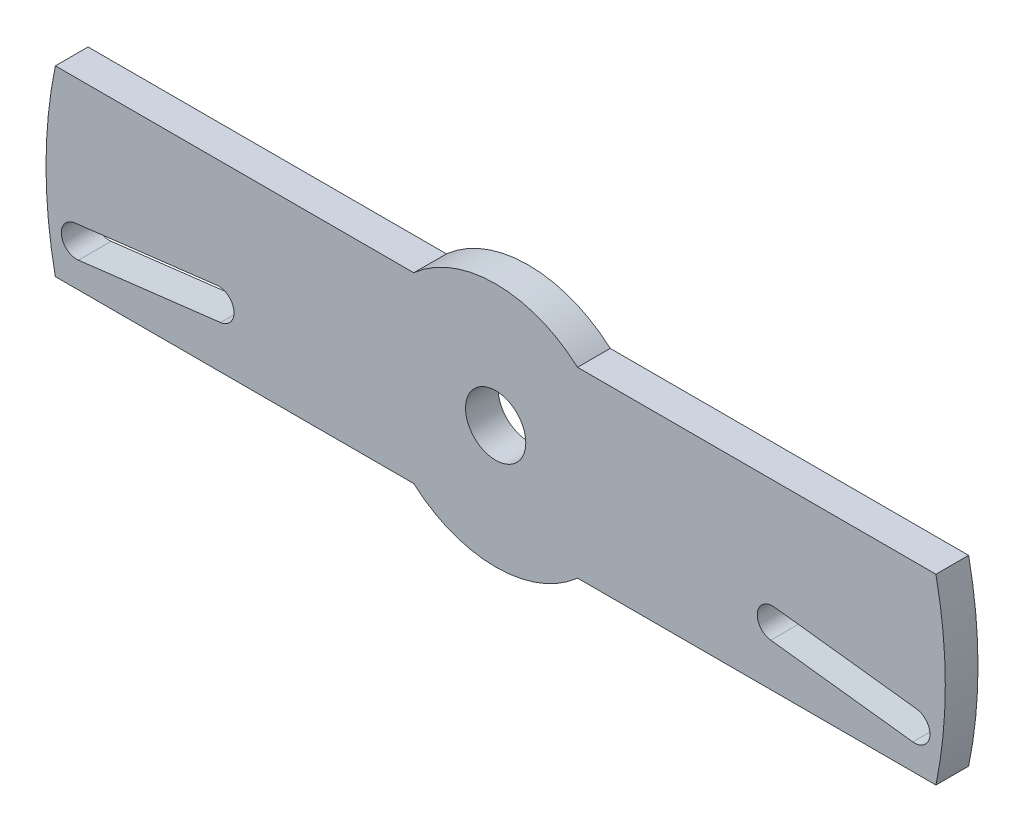
ISO-10303-21;
HEADER;
FILE_DESCRIPTION(('STEP AP214'),'2;1');
FILE_NAME('part.step','',(''),(''),'','','');
FILE_SCHEMA(('AUTOMOTIVE_DESIGN { 1 0 10303 214 1 1 1 1 }'));
ENDSEC;
DATA;
#1=APPLICATION_CONTEXT('core data for automotive mechanical design processes');
#2=APPLICATION_PROTOCOL_DEFINITION('international standard','automotive_design',2000,#1);
#3=PRODUCT_CONTEXT('',#1,'mechanical');
#4=PRODUCT('Part','Part','',(#3));
#5=PRODUCT_RELATED_PRODUCT_CATEGORY('part','',(#4));
#6=PRODUCT_DEFINITION_FORMATION('','',#4);
#7=PRODUCT_DEFINITION_CONTEXT('part definition',#1,'design');
#8=PRODUCT_DEFINITION('design','',#6,#7);
#9=PRODUCT_DEFINITION_SHAPE('','',#8);
#10=(LENGTH_UNIT() NAMED_UNIT(*) SI_UNIT(.MILLI.,.METRE.));
#11=(NAMED_UNIT(*) PLANE_ANGLE_UNIT() SI_UNIT($,.RADIAN.));
#12=(NAMED_UNIT(*) SI_UNIT($,.STERADIAN.) SOLID_ANGLE_UNIT());
#13=UNCERTAINTY_MEASURE_WITH_UNIT(LENGTH_MEASURE(1.E-05),#10,'distance_accuracy_value','');
#14=(GEOMETRIC_REPRESENTATION_CONTEXT(3) GLOBAL_UNCERTAINTY_ASSIGNED_CONTEXT((#13)) GLOBAL_UNIT_ASSIGNED_CONTEXT((#10,
#11,#12)) REPRESENTATION_CONTEXT('',''));
#15=CARTESIAN_POINT('',(0.,0.,0.));
#16=DIRECTION('',(0.,0.,1.));
#17=DIRECTION('',(1.,0.,0.));
#18=AXIS2_PLACEMENT_3D('',#15,#16,#17);
#19=CARTESIAN_POINT('',(0.,0.,3.2));
#20=DIRECTION('',(0.,0.,1.));
#21=DIRECTION('',(1.,0.,0.));
#22=AXIS2_PLACEMENT_3D('',#19,#20,#21);
#23=PLANE('',#22);
#24=CARTESIAN_POINT('',(0.,0.,3.2));
#25=DIRECTION('',(0.,0.,1.));
#26=DIRECTION('',(1.,0.,0.));
#27=AXIS2_PLACEMENT_3D('',#24,#25,#26);
#28=CIRCLE('',#27,44.);
#29=CARTESIAN_POINT('',(-43.0835752270245,8.93339496816975,3.2));
#30=VERTEX_POINT('',#29);
#31=CARTESIAN_POINT('',(-43.0835752270245,-8.93339496816975,3.2));
#32=VERTEX_POINT('',#31);
#33=EDGE_CURVE('E252',#30,#32,#28,.T.);
#34=ORIENTED_EDGE('',*,*,#33,.T.);
#35=DIRECTION('',(1.,0.,0.));
#36=VECTOR('',#35,1.);
#37=CARTESIAN_POINT('',(-43.0835752270245,-8.93339496816975,3.2));
#38=LINE('',#37,#36);
#39=CARTESIAN_POINT('',(-8.01214417884997,-8.93339496816975,3.2));
#40=VERTEX_POINT('',#39);
#41=EDGE_CURVE('E256',#32,#40,#38,.T.);
#42=ORIENTED_EDGE('',*,*,#41,.T.);
#43=CARTESIAN_POINT('',(0.,0.,3.2));
#44=DIRECTION('',(0.,0.,1.));
#45=DIRECTION('',(1.,0.,0.));
#46=AXIS2_PLACEMENT_3D('',#43,#44,#45);
#47=CIRCLE('',#46,12.);
#48=CARTESIAN_POINT('',(8.01214417884997,-8.93339496816975,3.2));
#49=VERTEX_POINT('',#48);
#50=EDGE_CURVE('E260',#40,#49,#47,.T.);
#51=ORIENTED_EDGE('',*,*,#50,.T.);
#52=DIRECTION('',(1.,0.,0.));
#53=VECTOR('',#52,1.);
#54=CARTESIAN_POINT('',(43.0835752270245,-8.93339496816975,3.2));
#55=LINE('',#54,#53);
#56=CARTESIAN_POINT('',(43.0835752270245,-8.93339496816974,3.2));
#57=VERTEX_POINT('',#56);
#58=EDGE_CURVE('E263',#49,#57,#55,.T.);
#59=ORIENTED_EDGE('',*,*,#58,.T.);
#60=CARTESIAN_POINT('',(0.,0.,3.2));
#61=DIRECTION('',(0.,0.,1.));
#62=DIRECTION('',(-1.,0.,0.));
#63=AXIS2_PLACEMENT_3D('',#60,#61,#62);
#64=CIRCLE('',#63,44.);
#65=CARTESIAN_POINT('',(43.0835752270245,8.93339496816975,3.2));
#66=VERTEX_POINT('',#65);
#67=EDGE_CURVE('E266',#57,#66,#64,.T.);
#68=ORIENTED_EDGE('',*,*,#67,.T.);
#69=DIRECTION('',(-1.,0.,0.));
#70=VECTOR('',#69,1.);
#71=CARTESIAN_POINT('',(43.0835752270245,8.93339496816975,3.2));
#72=LINE('',#71,#70);
#73=CARTESIAN_POINT('',(8.01214417884997,8.93339496816975,3.2));
#74=VERTEX_POINT('',#73);
#75=EDGE_CURVE('E269',#66,#74,#72,.T.);
#76=ORIENTED_EDGE('',*,*,#75,.T.);
#77=CARTESIAN_POINT('',(0.,0.,3.2));
#78=DIRECTION('',(0.,0.,1.));
#79=DIRECTION('',(1.,0.,0.));
#80=AXIS2_PLACEMENT_3D('',#77,#78,#79);
#81=CIRCLE('',#80,12.);
#82=CARTESIAN_POINT('',(-8.01214417884997,8.93339496816975,3.2));
#83=VERTEX_POINT('',#82);
#84=EDGE_CURVE('E272',#74,#83,#81,.T.);
#85=ORIENTED_EDGE('',*,*,#84,.T.);
#86=DIRECTION('',(-1.,0.,0.));
#87=VECTOR('',#86,1.);
#88=CARTESIAN_POINT('',(-43.0835752270245,8.93339496816975,3.2));
#89=LINE('',#88,#87);
#90=EDGE_CURVE('E275',#83,#30,#89,.T.);
#91=ORIENTED_EDGE('',*,*,#90,.T.);
#92=EDGE_LOOP('',(#34,#42,#51,#59,#68,#76,#85,#91));
#93=FACE_BOUND('',#92,.T.);
#94=CARTESIAN_POINT('',(0.,0.,3.2));
#95=DIRECTION('',(0.,0.,1.));
#96=DIRECTION('',(1.,0.,0.));
#97=AXIS2_PLACEMENT_3D('',#94,#95,#96);
#98=CIRCLE('',#97,2.95);
#99=CARTESIAN_POINT('',(2.95,0.,3.2));
#100=VERTEX_POINT('',#99);
#101=EDGE_CURVE('E244',#100,#100,#98,.T.);
#102=ORIENTED_EDGE('',*,*,#101,.F.);
#103=EDGE_LOOP('',(#102));
#104=FACE_BOUND('',#103,.T.);
#105=DIRECTION('',(0.992885299345467,0.119074692288758,0.));
#106=VECTOR('',#105,1.);
#107=CARTESIAN_POINT('',(-40.8213879615669,-6.4063736410608,3.2));
#108=LINE('',#107,#106);
#109=CARTESIAN_POINT('',(-40.8213879615669,-6.4063736410608,3.2));
#110=VERTEX_POINT('',#109);
#111=CARTESIAN_POINT('',(-26.9209937707303,-4.7393279490182,3.2));
#112=VERTEX_POINT('',#111);
#113=EDGE_CURVE('E204',#110,#112,#108,.T.);
#114=ORIENTED_EDGE('',*,*,#113,.F.);
#115=CARTESIAN_POINT('',(-41.,-4.91704569204261,3.2));
#116=DIRECTION('',(0.,0.,1.));
#117=DIRECTION('',(1.,0.,0.));
#118=AXIS2_PLACEMENT_3D('',#115,#116,#117);
#119=CIRCLE('',#118,1.5);
#120=CARTESIAN_POINT('',(-41.1786120384331,-3.42771774302441,3.2));
#121=VERTEX_POINT('',#120);
#122=EDGE_CURVE('E201',#121,#110,#119,.T.);
#123=ORIENTED_EDGE('',*,*,#122,.F.);
#124=DIRECTION('',(-0.992885299345467,-0.119074692288758,0.));
#125=VECTOR('',#124,1.);
#126=CARTESIAN_POINT('',(-41.1786120384331,-3.42771774302441,3.2));
#127=LINE('',#126,#125);
#128=CARTESIAN_POINT('',(-27.2782178475966,-1.7606720509818,3.2));
#129=VERTEX_POINT('',#128);
#130=EDGE_CURVE('E212',#129,#121,#127,.T.);
#131=ORIENTED_EDGE('',*,*,#130,.F.);
#132=CARTESIAN_POINT('',(-27.0996058091635,-3.25,3.2));
#133=DIRECTION('',(0.,0.,1.));
#134=DIRECTION('',(1.,0.,0.));
#135=AXIS2_PLACEMENT_3D('',#132,#133,#134);
#136=CIRCLE('',#135,1.5);
#137=EDGE_CURVE('E208',#112,#129,#136,.T.);
#138=ORIENTED_EDGE('',*,*,#137,.F.);
#139=EDGE_LOOP('',(#114,#123,#131,#138));
#140=FACE_BOUND('',#139,.T.);
#141=DIRECTION('',(-0.992885299345467,0.119074692288758,0.));
#142=VECTOR('',#141,1.);
#143=CARTESIAN_POINT('',(41.1786120384331,-3.42771774302441,3.2));
#144=LINE('',#143,#142);
#145=CARTESIAN_POINT('',(41.1786120384331,-3.42771774302441,3.2));
#146=VERTEX_POINT('',#145);
#147=CARTESIAN_POINT('',(27.2782178475966,-1.7606720509818,3.2));
#148=VERTEX_POINT('',#147);
#149=EDGE_CURVE('E162',#146,#148,#144,.T.);
#150=ORIENTED_EDGE('',*,*,#149,.F.);
#151=CARTESIAN_POINT('',(41.,-4.91704569204261,3.2));
#152=DIRECTION('',(0.,0.,1.));
#153=DIRECTION('',(-1.,0.,0.));
#154=AXIS2_PLACEMENT_3D('',#151,#152,#153);
#155=CIRCLE('',#154,1.5);
#156=CARTESIAN_POINT('',(40.8213879615669,-6.4063736410608,3.2));
#157=VERTEX_POINT('',#156);
#158=EDGE_CURVE('E153',#157,#146,#155,.T.);
#159=ORIENTED_EDGE('',*,*,#158,.F.);
#160=DIRECTION('',(0.992885299345467,-0.119074692288758,0.));
#161=VECTOR('',#160,1.);
#162=CARTESIAN_POINT('',(40.8213879615669,-6.4063736410608,3.2));
#163=LINE('',#162,#161);
#164=CARTESIAN_POINT('',(26.9209937707303,-4.7393279490182,3.2));
#165=VERTEX_POINT('',#164);
#166=EDGE_CURVE('E179',#165,#157,#163,.T.);
#167=ORIENTED_EDGE('',*,*,#166,.F.);
#168=CARTESIAN_POINT('',(27.0996058091635,-3.25,3.2));
#169=DIRECTION('',(0.,0.,1.));
#170=DIRECTION('',(-1.,0.,0.));
#171=AXIS2_PLACEMENT_3D('',#168,#169,#170);
#172=CIRCLE('',#171,1.5);
#173=EDGE_CURVE('E175',#148,#165,#172,.T.);
#174=ORIENTED_EDGE('',*,*,#173,.F.);
#175=EDGE_LOOP('',(#150,#159,#167,#174));
#176=FACE_BOUND('',#175,.T.);
#177=ADVANCED_FACE('F39',(#93,#104,#140,#176),#23,.T.);
#178=CARTESIAN_POINT('',(0.,0.,0.));
#179=DIRECTION('',(0.,0.,1.));
#180=DIRECTION('',(1.,0.,0.));
#181=AXIS2_PLACEMENT_3D('',#178,#179,#180);
#182=PLANE('',#181);
#183=CARTESIAN_POINT('',(-41.,-4.91704569204261,0.));
#184=DIRECTION('',(0.,0.,1.));
#185=DIRECTION('',(1.,0.,0.));
#186=AXIS2_PLACEMENT_3D('',#183,#184,#185);
#187=CIRCLE('',#186,1.5);
#188=CARTESIAN_POINT('',(-41.1786120384331,-3.42771774302441,0.));
#189=VERTEX_POINT('',#188);
#190=CARTESIAN_POINT('',(-40.8213879615669,-6.4063736410608,0.));
#191=VERTEX_POINT('',#190);
#192=EDGE_CURVE('E171',#189,#191,#187,.T.);
#193=ORIENTED_EDGE('',*,*,#192,.T.);
#194=DIRECTION('',(0.992885299345467,0.119074692288758,0.));
#195=VECTOR('',#194,1.);
#196=CARTESIAN_POINT('',(-40.8213879615669,-6.4063736410608,0.));
#197=LINE('',#196,#195);
#198=CARTESIAN_POINT('',(-26.9209937707303,-4.7393279490182,0.));
#199=VERTEX_POINT('',#198);
#200=EDGE_CURVE('E219',#191,#199,#197,.T.);
#201=ORIENTED_EDGE('',*,*,#200,.T.);
#202=CARTESIAN_POINT('',(-27.0996058091635,-3.25,0.));
#203=DIRECTION('',(0.,0.,1.));
#204=DIRECTION('',(1.,0.,0.));
#205=AXIS2_PLACEMENT_3D('',#202,#203,#204);
#206=CIRCLE('',#205,1.5);
#207=CARTESIAN_POINT('',(-27.2782178475966,-1.7606720509818,0.));
#208=VERTEX_POINT('',#207);
#209=EDGE_CURVE('E223',#199,#208,#206,.T.);
#210=ORIENTED_EDGE('',*,*,#209,.T.);
#211=DIRECTION('',(-0.992885299345467,-0.119074692288758,0.));
#212=VECTOR('',#211,1.);
#213=CARTESIAN_POINT('',(-41.1786120384331,-3.42771774302441,0.));
#214=LINE('',#213,#212);
#215=EDGE_CURVE('E205',#208,#189,#214,.T.);
#216=ORIENTED_EDGE('',*,*,#215,.T.);
#217=EDGE_LOOP('',(#193,#201,#210,#216));
#218=FACE_BOUND('',#217,.T.);
#219=CARTESIAN_POINT('',(0.,0.,0.));
#220=DIRECTION('',(0.,0.,1.));
#221=DIRECTION('',(1.,0.,0.));
#222=AXIS2_PLACEMENT_3D('',#219,#220,#221);
#223=CIRCLE('',#222,44.);
#224=CARTESIAN_POINT('',(-43.0835752270245,8.93339496816975,0.));
#225=VERTEX_POINT('',#224);
#226=CARTESIAN_POINT('',(-43.0835752270245,-8.93339496816975,0.));
#227=VERTEX_POINT('',#226);
#228=EDGE_CURVE('E248',#225,#227,#223,.T.);
#229=ORIENTED_EDGE('',*,*,#228,.F.);
#230=DIRECTION('',(-1.,0.,0.));
#231=VECTOR('',#230,1.);
#232=CARTESIAN_POINT('',(-43.0835752270245,8.93339496816975,0.));
#233=LINE('',#232,#231);
#234=CARTESIAN_POINT('',(-8.01214417884997,8.93339496816975,0.));
#235=VERTEX_POINT('',#234);
#236=EDGE_CURVE('E257',#235,#225,#233,.T.);
#237=ORIENTED_EDGE('',*,*,#236,.F.);
#238=CARTESIAN_POINT('',(0.,0.,0.));
#239=DIRECTION('',(0.,0.,1.));
#240=DIRECTION('',(1.,0.,0.));
#241=AXIS2_PLACEMENT_3D('',#238,#239,#240);
#242=CIRCLE('',#241,12.);
#243=CARTESIAN_POINT('',(8.01214417884997,8.93339496816975,0.));
#244=VERTEX_POINT('',#243);
#245=EDGE_CURVE('E297',#244,#235,#242,.T.);
#246=ORIENTED_EDGE('',*,*,#245,.F.);
#247=DIRECTION('',(-1.,0.,0.));
#248=VECTOR('',#247,1.);
#249=CARTESIAN_POINT('',(43.0835752270245,8.93339496816975,0.));
#250=LINE('',#249,#248);
#251=CARTESIAN_POINT('',(43.0835752270245,8.93339496816975,0.));
#252=VERTEX_POINT('',#251);
#253=EDGE_CURVE('E294',#252,#244,#250,.T.);
#254=ORIENTED_EDGE('',*,*,#253,.F.);
#255=CARTESIAN_POINT('',(0.,0.,0.));
#256=DIRECTION('',(0.,0.,1.));
#257=DIRECTION('',(-1.,0.,0.));
#258=AXIS2_PLACEMENT_3D('',#255,#256,#257);
#259=CIRCLE('',#258,44.);
#260=CARTESIAN_POINT('',(43.0835752270245,-8.93339496816974,0.));
#261=VERTEX_POINT('',#260);
#262=EDGE_CURVE('E291',#261,#252,#259,.T.);
#263=ORIENTED_EDGE('',*,*,#262,.F.);
#264=DIRECTION('',(1.,0.,0.));
#265=VECTOR('',#264,1.);
#266=CARTESIAN_POINT('',(43.0835752270245,-8.93339496816975,0.));
#267=LINE('',#266,#265);
#268=CARTESIAN_POINT('',(8.01214417884997,-8.93339496816975,0.));
#269=VERTEX_POINT('',#268);
#270=EDGE_CURVE('E288',#269,#261,#267,.T.);
#271=ORIENTED_EDGE('',*,*,#270,.F.);
#272=CARTESIAN_POINT('',(0.,0.,0.));
#273=DIRECTION('',(0.,0.,1.));
#274=DIRECTION('',(1.,0.,0.));
#275=AXIS2_PLACEMENT_3D('',#272,#273,#274);
#276=CIRCLE('',#275,12.);
#277=CARTESIAN_POINT('',(-8.01214417884997,-8.93339496816975,0.));
#278=VERTEX_POINT('',#277);
#279=EDGE_CURVE('E285',#278,#269,#276,.T.);
#280=ORIENTED_EDGE('',*,*,#279,.F.);
#281=DIRECTION('',(1.,0.,0.));
#282=VECTOR('',#281,1.);
#283=CARTESIAN_POINT('',(-43.0835752270245,-8.93339496816975,0.));
#284=LINE('',#283,#282);
#285=EDGE_CURVE('E282',#227,#278,#284,.T.);
#286=ORIENTED_EDGE('',*,*,#285,.F.);
#287=EDGE_LOOP('',(#229,#237,#246,#254,#263,#271,#280,#286));
#288=FACE_BOUND('',#287,.T.);
#289=CARTESIAN_POINT('',(0.,0.,0.));
#290=DIRECTION('',(0.,0.,1.));
#291=DIRECTION('',(1.,0.,0.));
#292=AXIS2_PLACEMENT_3D('',#289,#290,#291);
#293=CIRCLE('',#292,2.95);
#294=CARTESIAN_POINT('',(2.95,0.,0.));
#295=VERTEX_POINT('',#294);
#296=EDGE_CURVE('E243',#295,#295,#293,.T.);
#297=ORIENTED_EDGE('',*,*,#296,.T.);
#298=EDGE_LOOP('',(#297));
#299=FACE_BOUND('',#298,.T.);
#300=CARTESIAN_POINT('',(41.,-4.91704569204261,0.));
#301=DIRECTION('',(0.,0.,1.));
#302=DIRECTION('',(-1.,0.,0.));
#303=AXIS2_PLACEMENT_3D('',#300,#301,#302);
#304=CIRCLE('',#303,1.5);
#305=CARTESIAN_POINT('',(40.8213879615669,-6.4063736410608,0.));
#306=VERTEX_POINT('',#305);
#307=CARTESIAN_POINT('',(41.1786120384331,-3.42771774302441,0.));
#308=VERTEX_POINT('',#307);
#309=EDGE_CURVE('E63',#306,#308,#304,.T.);
#310=ORIENTED_EDGE('',*,*,#309,.T.);
#311=DIRECTION('',(-0.992885299345467,0.119074692288758,0.));
#312=VECTOR('',#311,1.);
#313=CARTESIAN_POINT('',(41.1786120384331,-3.42771774302441,0.));
#314=LINE('',#313,#312);
#315=CARTESIAN_POINT('',(27.2782178475966,-1.7606720509818,0.));
#316=VERTEX_POINT('',#315);
#317=EDGE_CURVE('E169',#308,#316,#314,.T.);
#318=ORIENTED_EDGE('',*,*,#317,.T.);
#319=CARTESIAN_POINT('',(27.0996058091635,-3.25,0.));
#320=DIRECTION('',(0.,0.,1.));
#321=DIRECTION('',(-1.,0.,0.));
#322=AXIS2_PLACEMENT_3D('',#319,#320,#321);
#323=CIRCLE('',#322,1.5);
#324=CARTESIAN_POINT('',(26.9209937707303,-4.7393279490182,0.));
#325=VERTEX_POINT('',#324);
#326=EDGE_CURVE('E188',#316,#325,#323,.T.);
#327=ORIENTED_EDGE('',*,*,#326,.T.);
#328=DIRECTION('',(0.992885299345467,-0.119074692288758,0.));
#329=VECTOR('',#328,1.);
#330=CARTESIAN_POINT('',(40.8213879615669,-6.4063736410608,0.));
#331=LINE('',#330,#329);
#332=EDGE_CURVE('E163',#325,#306,#331,.T.);
#333=ORIENTED_EDGE('',*,*,#332,.T.);
#334=EDGE_LOOP('',(#310,#318,#327,#333));
#335=FACE_BOUND('',#334,.T.);
#336=ADVANCED_FACE('F336',(#218,#288,#299,#335),#182,.F.);
#337=CARTESIAN_POINT('',(0.,0.,3.2));
#338=DIRECTION('',(0.,0.,-1.));
#339=DIRECTION('',(-1.,0.,0.));
#340=AXIS2_PLACEMENT_3D('',#337,#338,#339);
#341=CYLINDRICAL_SURFACE('',#340,44.);
#342=ORIENTED_EDGE('',*,*,#228,.T.);
#343=DIRECTION('',(0.,0.,-1.));
#344=VECTOR('',#343,1.);
#345=CARTESIAN_POINT('',(-43.0835752270245,-8.93339496816975,3.2));
#346=LINE('',#345,#344);
#347=EDGE_CURVE('E11',#32,#227,#346,.T.);
#348=ORIENTED_EDGE('',*,*,#347,.F.);
#349=ORIENTED_EDGE('',*,*,#33,.F.);
#350=DIRECTION('',(0.,0.,-1.));
#351=VECTOR('',#350,1.);
#352=CARTESIAN_POINT('',(-43.0835752270245,8.93339496816975,3.2));
#353=LINE('',#352,#351);
#354=EDGE_CURVE('E278',#30,#225,#353,.T.);
#355=ORIENTED_EDGE('',*,*,#354,.T.);
#356=EDGE_LOOP('',(#342,#348,#349,#355));
#357=FACE_BOUND('',#356,.T.);
#358=ADVANCED_FACE('F41',(#357),#341,.T.);
#359=CARTESIAN_POINT('',(-43.0835752270245,-8.93339496816975,3.2));
#360=DIRECTION('',(0.,1.,0.));
#361=DIRECTION('',(0.,0.,1.));
#362=AXIS2_PLACEMENT_3D('',#359,#360,#361);
#363=PLANE('',#362);
#364=ORIENTED_EDGE('',*,*,#285,.T.);
#365=DIRECTION('',(0.,0.,-1.));
#366=VECTOR('',#365,1.);
#367=CARTESIAN_POINT('',(-8.01214417884997,-8.93339496816975,3.2));
#368=LINE('',#367,#366);
#369=EDGE_CURVE('E48',#40,#278,#368,.T.);
#370=ORIENTED_EDGE('',*,*,#369,.F.);
#371=ORIENTED_EDGE('',*,*,#41,.F.);
#372=ORIENTED_EDGE('',*,*,#347,.T.);
#373=EDGE_LOOP('',(#364,#370,#371,#372));
#374=FACE_BOUND('',#373,.T.);
#375=ADVANCED_FACE('F354',(#374),#363,.F.);
#376=CARTESIAN_POINT('',(0.,0.,3.2));
#377=DIRECTION('',(0.,0.,-1.));
#378=DIRECTION('',(-1.,0.,0.));
#379=AXIS2_PLACEMENT_3D('',#376,#377,#378);
#380=CYLINDRICAL_SURFACE('',#379,12.);
#381=ORIENTED_EDGE('',*,*,#279,.T.);
#382=DIRECTION('',(0.,0.,-1.));
#383=VECTOR('',#382,1.);
#384=CARTESIAN_POINT('',(8.01214417884997,-8.93339496816975,3.2));
#385=LINE('',#384,#383);
#386=EDGE_CURVE('E321',#49,#269,#385,.T.);
#387=ORIENTED_EDGE('',*,*,#386,.F.);
#388=ORIENTED_EDGE('',*,*,#50,.F.);
#389=ORIENTED_EDGE('',*,*,#369,.T.);
#390=EDGE_LOOP('',(#381,#387,#388,#389));
#391=FACE_BOUND('',#390,.T.);
#392=ADVANCED_FACE('F330',(#391),#380,.T.);
#393=CARTESIAN_POINT('',(43.0835752270245,-8.93339496816975,3.2));
#394=DIRECTION('',(0.,1.,0.));
#395=DIRECTION('',(0.,0.,1.));
#396=AXIS2_PLACEMENT_3D('',#393,#394,#395);
#397=PLANE('',#396);
#398=ORIENTED_EDGE('',*,*,#270,.T.);
#399=DIRECTION('',(0.,0.,-1.));
#400=VECTOR('',#399,1.);
#401=CARTESIAN_POINT('',(43.0835752270245,-8.93339496816974,3.2));
#402=LINE('',#401,#400);
#403=EDGE_CURVE('E317',#57,#261,#402,.T.);
#404=ORIENTED_EDGE('',*,*,#403,.F.);
#405=ORIENTED_EDGE('',*,*,#58,.F.);
#406=ORIENTED_EDGE('',*,*,#386,.T.);
#407=EDGE_LOOP('',(#398,#404,#405,#406));
#408=FACE_BOUND('',#407,.T.);
#409=ADVANCED_FACE('F342',(#408),#397,.F.);
#410=CARTESIAN_POINT('',(0.,0.,3.2));
#411=DIRECTION('',(0.,0.,-1.));
#412=DIRECTION('',(-1.,0.,0.));
#413=AXIS2_PLACEMENT_3D('',#410,#411,#412);
#414=CYLINDRICAL_SURFACE('',#413,44.);
#415=ORIENTED_EDGE('',*,*,#262,.T.);
#416=DIRECTION('',(0.,0.,-1.));
#417=VECTOR('',#416,1.);
#418=CARTESIAN_POINT('',(43.0835752270245,8.93339496816975,3.2));
#419=LINE('',#418,#417);
#420=EDGE_CURVE('E313',#66,#252,#419,.T.);
#421=ORIENTED_EDGE('',*,*,#420,.F.);
#422=ORIENTED_EDGE('',*,*,#67,.F.);
#423=ORIENTED_EDGE('',*,*,#403,.T.);
#424=EDGE_LOOP('',(#415,#421,#422,#423));
#425=FACE_BOUND('',#424,.T.);
#426=ADVANCED_FACE('F346',(#425),#414,.T.);
#427=CARTESIAN_POINT('',(43.0835752270245,8.93339496816975,3.2));
#428=DIRECTION('',(0.,-1.,0.));
#429=DIRECTION('',(0.,0.,-1.));
#430=AXIS2_PLACEMENT_3D('',#427,#428,#429);
#431=PLANE('',#430);
#432=ORIENTED_EDGE('',*,*,#253,.T.);
#433=DIRECTION('',(0.,0.,-1.));
#434=VECTOR('',#433,1.);
#435=CARTESIAN_POINT('',(8.01214417884997,8.93339496816975,3.2));
#436=LINE('',#435,#434);
#437=EDGE_CURVE('E309',#74,#244,#436,.T.);
#438=ORIENTED_EDGE('',*,*,#437,.F.);
#439=ORIENTED_EDGE('',*,*,#75,.F.);
#440=ORIENTED_EDGE('',*,*,#420,.T.);
#441=EDGE_LOOP('',(#432,#438,#439,#440));
#442=FACE_BOUND('',#441,.T.);
#443=ADVANCED_FACE('F367',(#442),#431,.F.);
#444=CARTESIAN_POINT('',(0.,0.,3.2));
#445=DIRECTION('',(0.,0.,-1.));
#446=DIRECTION('',(-1.,0.,0.));
#447=AXIS2_PLACEMENT_3D('',#444,#445,#446);
#448=CYLINDRICAL_SURFACE('',#447,12.);
#449=ORIENTED_EDGE('',*,*,#245,.T.);
#450=DIRECTION('',(0.,0.,-1.));
#451=VECTOR('',#450,1.);
#452=CARTESIAN_POINT('',(-8.01214417884997,8.93339496816975,3.2));
#453=LINE('',#452,#451);
#454=EDGE_CURVE('E305',#83,#235,#453,.T.);
#455=ORIENTED_EDGE('',*,*,#454,.F.);
#456=ORIENTED_EDGE('',*,*,#84,.F.);
#457=ORIENTED_EDGE('',*,*,#437,.T.);
#458=EDGE_LOOP('',(#449,#455,#456,#457));
#459=FACE_BOUND('',#458,.T.);
#460=ADVANCED_FACE('F365',(#459),#448,.T.);
#461=CARTESIAN_POINT('',(-43.0835752270245,8.93339496816975,3.2));
#462=DIRECTION('',(0.,-1.,0.));
#463=DIRECTION('',(0.,0.,-1.));
#464=AXIS2_PLACEMENT_3D('',#461,#462,#463);
#465=PLANE('',#464);
#466=ORIENTED_EDGE('',*,*,#236,.T.);
#467=ORIENTED_EDGE('',*,*,#354,.F.);
#468=ORIENTED_EDGE('',*,*,#90,.F.);
#469=ORIENTED_EDGE('',*,*,#454,.T.);
#470=EDGE_LOOP('',(#466,#467,#468,#469));
#471=FACE_BOUND('',#470,.T.);
#472=ADVANCED_FACE('F360',(#471),#465,.F.);
#473=CARTESIAN_POINT('',(0.,0.,3.2));
#474=DIRECTION('',(0.,0.,-1.));
#475=DIRECTION('',(-1.,0.,0.));
#476=AXIS2_PLACEMENT_3D('',#473,#474,#475);
#477=CYLINDRICAL_SURFACE('',#476,2.95);
#478=ORIENTED_EDGE('',*,*,#101,.T.);
#479=EDGE_LOOP('',(#478));
#480=FACE_BOUND('',#479,.T.);
#481=ORIENTED_EDGE('',*,*,#296,.F.);
#482=EDGE_LOOP('',(#481));
#483=FACE_BOUND('',#482,.T.);
#484=ADVANCED_FACE('F384',(#480,#483),#477,.F.);
#485=CARTESIAN_POINT('',(-41.,-4.91704569204261,3.2));
#486=DIRECTION('',(0.,0.,-1.));
#487=DIRECTION('',(-1.,0.,0.));
#488=AXIS2_PLACEMENT_3D('',#485,#486,#487);
#489=CYLINDRICAL_SURFACE('',#488,1.5);
#490=ORIENTED_EDGE('',*,*,#192,.F.);
#491=DIRECTION('',(0.,0.,-1.));
#492=VECTOR('',#491,1.);
#493=CARTESIAN_POINT('',(-41.1786120384331,-3.42771774302441,3.2));
#494=LINE('',#493,#492);
#495=EDGE_CURVE('E215',#121,#189,#494,.T.);
#496=ORIENTED_EDGE('',*,*,#495,.F.);
#497=ORIENTED_EDGE('',*,*,#122,.T.);
#498=DIRECTION('',(0.,0.,-1.));
#499=VECTOR('',#498,1.);
#500=CARTESIAN_POINT('',(-40.8213879615669,-6.4063736410608,3.2));
#501=LINE('',#500,#499);
#502=EDGE_CURVE('E239',#110,#191,#501,.T.);
#503=ORIENTED_EDGE('',*,*,#502,.T.);
#504=EDGE_LOOP('',(#490,#496,#497,#503));
#505=FACE_BOUND('',#504,.T.);
#506=ADVANCED_FACE('F391',(#505),#489,.F.);
#507=CARTESIAN_POINT('',(-40.8213879615669,-6.4063736410608,3.2));
#508=DIRECTION('',(-0.119074692288758,0.992885299345467,0.));
#509=DIRECTION('',(-0.992885299345467,-0.119074692288758,0.));
#510=AXIS2_PLACEMENT_3D('',#507,#508,#509);
#511=PLANE('',#510);
#512=ORIENTED_EDGE('',*,*,#200,.F.);
#513=ORIENTED_EDGE('',*,*,#502,.F.);
#514=ORIENTED_EDGE('',*,*,#113,.T.);
#515=DIRECTION('',(0.,0.,-1.));
#516=VECTOR('',#515,1.);
#517=CARTESIAN_POINT('',(-26.9209937707303,-4.7393279490182,3.2));
#518=LINE('',#517,#516);
#519=EDGE_CURVE('E236',#112,#199,#518,.T.);
#520=ORIENTED_EDGE('',*,*,#519,.T.);
#521=EDGE_LOOP('',(#512,#513,#514,#520));
#522=FACE_BOUND('',#521,.T.);
#523=ADVANCED_FACE('F396',(#522),#511,.T.);
#524=CARTESIAN_POINT('',(-27.0996058091635,-3.25,3.2));
#525=DIRECTION('',(0.,0.,-1.));
#526=DIRECTION('',(-1.,0.,0.));
#527=AXIS2_PLACEMENT_3D('',#524,#525,#526);
#528=CYLINDRICAL_SURFACE('',#527,1.5);
#529=ORIENTED_EDGE('',*,*,#209,.F.);
#530=ORIENTED_EDGE('',*,*,#519,.F.);
#531=ORIENTED_EDGE('',*,*,#137,.T.);
#532=DIRECTION('',(0.,0.,-1.));
#533=VECTOR('',#532,1.);
#534=CARTESIAN_POINT('',(-27.2782178475966,-1.7606720509818,3.2));
#535=LINE('',#534,#533);
#536=EDGE_CURVE('E233',#129,#208,#535,.T.);
#537=ORIENTED_EDGE('',*,*,#536,.T.);
#538=EDGE_LOOP('',(#529,#530,#531,#537));
#539=FACE_BOUND('',#538,.T.);
#540=ADVANCED_FACE('F420',(#539),#528,.F.);
#541=CARTESIAN_POINT('',(-41.1786120384331,-3.42771774302441,3.2));
#542=DIRECTION('',(0.119074692288758,-0.992885299345467,0.));
#543=DIRECTION('',(0.992885299345467,0.119074692288758,0.));
#544=AXIS2_PLACEMENT_3D('',#541,#542,#543);
#545=PLANE('',#544);
#546=ORIENTED_EDGE('',*,*,#215,.F.);
#547=ORIENTED_EDGE('',*,*,#536,.F.);
#548=ORIENTED_EDGE('',*,*,#130,.T.);
#549=ORIENTED_EDGE('',*,*,#495,.T.);
#550=EDGE_LOOP('',(#546,#547,#548,#549));
#551=FACE_BOUND('',#550,.T.);
#552=ADVANCED_FACE('F417',(#551),#545,.T.);
#553=CARTESIAN_POINT('',(41.,-4.91704569204261,3.2));
#554=DIRECTION('',(0.,0.,-1.));
#555=DIRECTION('',(-1.,0.,0.));
#556=AXIS2_PLACEMENT_3D('',#553,#554,#555);
#557=CYLINDRICAL_SURFACE('',#556,1.5);
#558=ORIENTED_EDGE('',*,*,#309,.F.);
#559=DIRECTION('',(0.,0.,-1.));
#560=VECTOR('',#559,1.);
#561=CARTESIAN_POINT('',(40.8213879615669,-6.4063736410608,3.2));
#562=LINE('',#561,#560);
#563=EDGE_CURVE('E157',#157,#306,#562,.T.);
#564=ORIENTED_EDGE('',*,*,#563,.F.);
#565=ORIENTED_EDGE('',*,*,#158,.T.);
#566=DIRECTION('',(0.,0.,-1.));
#567=VECTOR('',#566,1.);
#568=CARTESIAN_POINT('',(41.1786120384331,-3.42771774302441,3.2));
#569=LINE('',#568,#567);
#570=EDGE_CURVE('E156',#146,#308,#569,.T.);
#571=ORIENTED_EDGE('',*,*,#570,.T.);
#572=EDGE_LOOP('',(#558,#564,#565,#571));
#573=FACE_BOUND('',#572,.T.);
#574=ADVANCED_FACE('F155',(#573),#557,.F.);
#575=CARTESIAN_POINT('',(41.1786120384331,-3.42771774302441,3.2));
#576=DIRECTION('',(-0.119074692288758,-0.992885299345467,0.));
#577=DIRECTION('',(0.992885299345467,-0.119074692288758,0.));
#578=AXIS2_PLACEMENT_3D('',#575,#576,#577);
#579=PLANE('',#578);
#580=ORIENTED_EDGE('',*,*,#317,.F.);
#581=ORIENTED_EDGE('',*,*,#570,.F.);
#582=ORIENTED_EDGE('',*,*,#149,.T.);
#583=DIRECTION('',(0.,0.,-1.));
#584=VECTOR('',#583,1.);
#585=CARTESIAN_POINT('',(27.2782178475966,-1.7606720509818,3.2));
#586=LINE('',#585,#584);
#587=EDGE_CURVE('E172',#148,#316,#586,.T.);
#588=ORIENTED_EDGE('',*,*,#587,.T.);
#589=EDGE_LOOP('',(#580,#581,#582,#588));
#590=FACE_BOUND('',#589,.T.);
#591=ADVANCED_FACE('F166',(#590),#579,.T.);
#592=CARTESIAN_POINT('',(27.0996058091635,-3.25,3.2));
#593=DIRECTION('',(0.,0.,-1.));
#594=DIRECTION('',(-1.,0.,0.));
#595=AXIS2_PLACEMENT_3D('',#592,#593,#594);
#596=CYLINDRICAL_SURFACE('',#595,1.5);
#597=ORIENTED_EDGE('',*,*,#326,.F.);
#598=ORIENTED_EDGE('',*,*,#587,.F.);
#599=ORIENTED_EDGE('',*,*,#173,.T.);
#600=DIRECTION('',(0.,0.,-1.));
#601=VECTOR('',#600,1.);
#602=CARTESIAN_POINT('',(26.9209937707303,-4.7393279490182,3.2));
#603=LINE('',#602,#601);
#604=EDGE_CURVE('E55',#165,#325,#603,.T.);
#605=ORIENTED_EDGE('',*,*,#604,.T.);
#606=EDGE_LOOP('',(#597,#598,#599,#605));
#607=FACE_BOUND('',#606,.T.);
#608=ADVANCED_FACE('F405',(#607),#596,.F.);
#609=CARTESIAN_POINT('',(40.8213879615669,-6.4063736410608,3.2));
#610=DIRECTION('',(0.119074692288758,0.992885299345467,0.));
#611=DIRECTION('',(-0.992885299345467,0.119074692288758,0.));
#612=AXIS2_PLACEMENT_3D('',#609,#610,#611);
#613=PLANE('',#612);
#614=ORIENTED_EDGE('',*,*,#332,.F.);
#615=ORIENTED_EDGE('',*,*,#604,.F.);
#616=ORIENTED_EDGE('',*,*,#166,.T.);
#617=ORIENTED_EDGE('',*,*,#563,.T.);
#618=EDGE_LOOP('',(#614,#615,#616,#617));
#619=FACE_BOUND('',#618,.T.);
#620=ADVANCED_FACE('F403',(#619),#613,.T.);
#621=CLOSED_SHELL('',(#177,#336,#358,#375,#392,#409,#426,#443,#460,#472,#484,#506,#523,#540,
#552,#574,#591,#608,#620));
#622=MANIFOLD_SOLID_BREP('B2',#621);
#623=ADVANCED_BREP_SHAPE_REPRESENTATION('',(#18,#622),#14);
#624=SHAPE_DEFINITION_REPRESENTATION(#9,#623);
ENDSEC;
END-ISO-10303-21;
